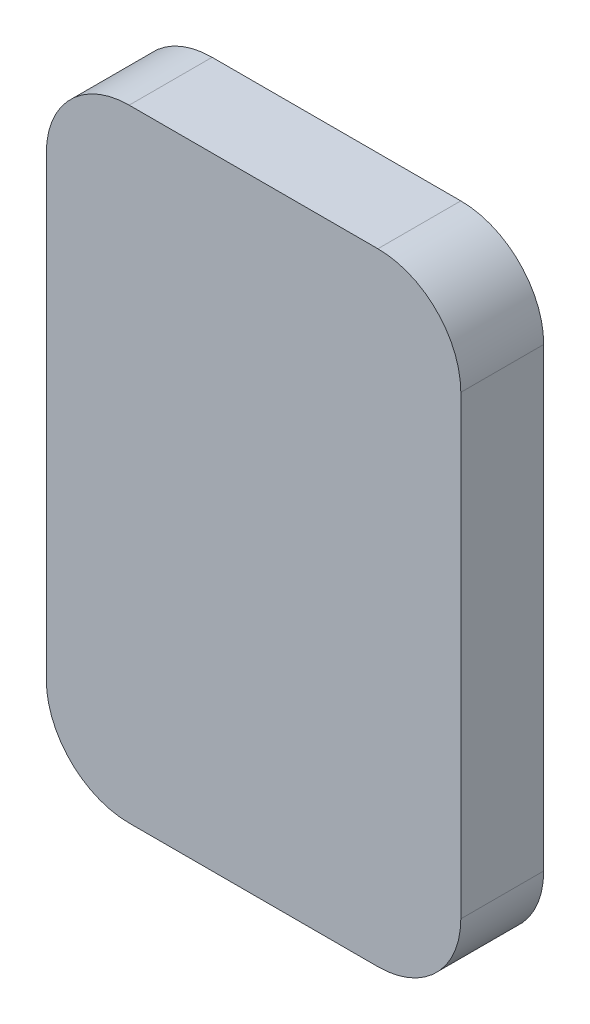
ISO-10303-21;
HEADER;
FILE_DESCRIPTION(('STEP AP214'),'2;1');
FILE_NAME('part.step','',(''),(''),'','','');
FILE_SCHEMA(('AUTOMOTIVE_DESIGN { 1 0 10303 214 1 1 1 1 }'));
ENDSEC;
DATA;
#1=APPLICATION_CONTEXT('core data for automotive mechanical design processes');
#2=APPLICATION_PROTOCOL_DEFINITION('international standard','automotive_design',2000,#1);
#3=PRODUCT_CONTEXT('',#1,'mechanical');
#4=PRODUCT('Part','Part','',(#3));
#5=PRODUCT_RELATED_PRODUCT_CATEGORY('part','',(#4));
#6=PRODUCT_DEFINITION_FORMATION('','',#4);
#7=PRODUCT_DEFINITION_CONTEXT('part definition',#1,'design');
#8=PRODUCT_DEFINITION('design','',#6,#7);
#9=PRODUCT_DEFINITION_SHAPE('','',#8);
#10=(LENGTH_UNIT() NAMED_UNIT(*) SI_UNIT(.MILLI.,.METRE.));
#11=(NAMED_UNIT(*) PLANE_ANGLE_UNIT() SI_UNIT($,.RADIAN.));
#12=(NAMED_UNIT(*) SI_UNIT($,.STERADIAN.) SOLID_ANGLE_UNIT());
#13=UNCERTAINTY_MEASURE_WITH_UNIT(LENGTH_MEASURE(1.E-05),#10,'distance_accuracy_value','');
#14=(GEOMETRIC_REPRESENTATION_CONTEXT(3) GLOBAL_UNCERTAINTY_ASSIGNED_CONTEXT((#13)) GLOBAL_UNIT_ASSIGNED_CONTEXT((#10,
#11,#12)) REPRESENTATION_CONTEXT('',''));
#15=CARTESIAN_POINT('',(0.,0.,0.));
#16=DIRECTION('',(0.,0.,1.));
#17=DIRECTION('',(1.,0.,0.));
#18=AXIS2_PLACEMENT_3D('',#15,#16,#17);
#19=CARTESIAN_POINT('',(-0.800186650059145,15.,1.25133902045073));
#20=DIRECTION('',(-1.,0.,0.));
#21=DIRECTION('',(0.,0.,1.));
#22=AXIS2_PLACEMENT_3D('',#19,#20,#21);
#23=PLANE('',#22);
#24=DIRECTION('',(0.,-1.,0.));
#25=VECTOR('',#24,1.);
#26=CARTESIAN_POINT('',(-0.800186650059145,15.,3.25133902045073));
#27=LINE('',#26,#25);
#28=CARTESIAN_POINT('',(-0.800186650059145,13.,3.25133902045073));
#29=VERTEX_POINT('',#28);
#30=CARTESIAN_POINT('',(-0.800186650059145,2.,3.25133902045073));
#31=VERTEX_POINT('',#30);
#32=EDGE_CURVE('E191',#29,#31,#27,.T.);
#33=ORIENTED_EDGE('',*,*,#32,.T.);
#34=DIRECTION('',(0.,0.,-1.));
#35=VECTOR('',#34,1.);
#36=CARTESIAN_POINT('',(-0.800186650059145,2.,1.25133902045073));
#37=LINE('',#36,#35);
#38=CARTESIAN_POINT('',(-0.800186650059145,2.,1.25133902045073));
#39=VERTEX_POINT('',#38);
#40=EDGE_CURVE('E216',#31,#39,#37,.T.);
#41=ORIENTED_EDGE('',*,*,#40,.T.);
#42=DIRECTION('',(0.,-1.,0.));
#43=VECTOR('',#42,1.);
#44=CARTESIAN_POINT('',(-0.800186650059145,15.,1.25133902045073));
#45=LINE('',#44,#43);
#46=CARTESIAN_POINT('',(-0.800186650059145,13.,1.25133902045073));
#47=VERTEX_POINT('',#46);
#48=EDGE_CURVE('E203',#47,#39,#45,.T.);
#49=ORIENTED_EDGE('',*,*,#48,.F.);
#50=DIRECTION('',(0.,0.,-1.));
#51=VECTOR('',#50,1.);
#52=CARTESIAN_POINT('',(-0.800186650059145,13.,3.25133902045073));
#53=LINE('',#52,#51);
#54=EDGE_CURVE('E214',#47,#29,#53,.F.);
#55=ORIENTED_EDGE('',*,*,#54,.T.);
#56=EDGE_LOOP('',(#33,#41,#49,#55));
#57=FACE_BOUND('',#56,.T.);
#58=ADVANCED_FACE('F33',(#57),#23,.F.);
#59=CARTESIAN_POINT('',(-10.8001866500591,15.,1.25133902045073));
#60=DIRECTION('',(0.,0.,1.));
#61=DIRECTION('',(1.,0.,0.));
#62=AXIS2_PLACEMENT_3D('',#59,#60,#61);
#63=PLANE('',#62);
#64=DIRECTION('',(1.,0.,0.));
#65=VECTOR('',#64,1.);
#66=CARTESIAN_POINT('',(-10.8001866500591,1.6,1.25133902045073));
#67=LINE('',#66,#65);
#68=CARTESIAN_POINT('',(-6.80018665005915,1.6,1.25133902045073));
#69=VERTEX_POINT('',#68);
#70=CARTESIAN_POINT('',(-4.80018665005915,1.6,1.25133902045073));
#71=VERTEX_POINT('',#70);
#72=EDGE_CURVE('E250',#69,#71,#67,.T.);
#73=ORIENTED_EDGE('',*,*,#72,.T.);
#74=DIRECTION('',(0.,-1.,0.));
#75=VECTOR('',#74,1.);
#76=CARTESIAN_POINT('',(-4.80018665005915,15.,1.25133902045073));
#77=LINE('',#76,#75);
#78=CARTESIAN_POINT('',(-4.80018665005915,7.5,1.25133902045073));
#79=VERTEX_POINT('',#78);
#80=EDGE_CURVE('E212',#79,#71,#77,.T.);
#81=ORIENTED_EDGE('',*,*,#80,.F.);
#82=DIRECTION('',(1.,0.,0.));
#83=VECTOR('',#82,1.);
#84=CARTESIAN_POINT('',(-10.8001866500591,7.5,1.25133902045073));
#85=LINE('',#84,#83);
#86=CARTESIAN_POINT('',(-6.80018665005915,7.5,1.25133902045073));
#87=VERTEX_POINT('',#86);
#88=EDGE_CURVE('E206',#87,#79,#85,.T.);
#89=ORIENTED_EDGE('',*,*,#88,.F.);
#90=DIRECTION('',(0.,1.,0.));
#91=VECTOR('',#90,1.);
#92=CARTESIAN_POINT('',(-6.80018665005915,15.,1.25133902045073));
#93=LINE('',#92,#91);
#94=EDGE_CURVE('E209',#69,#87,#93,.T.);
#95=ORIENTED_EDGE('',*,*,#94,.F.);
#96=EDGE_LOOP('',(#73,#81,#89,#95));
#97=FACE_BOUND('',#96,.T.);
#98=ORIENTED_EDGE('',*,*,#48,.T.);
#99=CARTESIAN_POINT('',(-2.80018665005915,2.,1.25133902045073));
#100=DIRECTION('',(0.,0.,1.));
#101=DIRECTION('',(1.,0.,0.));
#102=AXIS2_PLACEMENT_3D('',#99,#100,#101);
#103=CIRCLE('',#102,2.);
#104=CARTESIAN_POINT('',(-2.80018665005915,0.,1.25133902045073));
#105=VERTEX_POINT('',#104);
#106=EDGE_CURVE('E225',#39,#105,#103,.F.);
#107=ORIENTED_EDGE('',*,*,#106,.T.);
#108=DIRECTION('',(-1.,0.,0.));
#109=VECTOR('',#108,1.);
#110=CARTESIAN_POINT('',(-10.8001866500591,0.,1.25133902045073));
#111=LINE('',#110,#109);
#112=CARTESIAN_POINT('',(-8.80018665005914,0.,1.25133902045073));
#113=VERTEX_POINT('',#112);
#114=EDGE_CURVE('E177',#105,#113,#111,.T.);
#115=ORIENTED_EDGE('',*,*,#114,.T.);
#116=CARTESIAN_POINT('',(-8.80018665005914,2.,1.25133902045073));
#117=DIRECTION('',(0.,0.,1.));
#118=DIRECTION('',(1.,0.,0.));
#119=AXIS2_PLACEMENT_3D('',#116,#117,#118);
#120=CIRCLE('',#119,2.);
#121=CARTESIAN_POINT('',(-10.8001866500591,2.,1.25133902045073));
#122=VERTEX_POINT('',#121);
#123=EDGE_CURVE('E223',#113,#122,#120,.F.);
#124=ORIENTED_EDGE('',*,*,#123,.T.);
#125=DIRECTION('',(0.,-1.,0.));
#126=VECTOR('',#125,1.);
#127=CARTESIAN_POINT('',(-10.8001866500591,15.,1.25133902045073));
#128=LINE('',#127,#126);
#129=CARTESIAN_POINT('',(-10.8001866500591,13.,1.25133902045073));
#130=VERTEX_POINT('',#129);
#131=EDGE_CURVE('E200',#130,#122,#128,.T.);
#132=ORIENTED_EDGE('',*,*,#131,.F.);
#133=CARTESIAN_POINT('',(-8.80018665005914,13.,1.25133902045073));
#134=DIRECTION('',(0.,0.,1.));
#135=DIRECTION('',(1.,0.,0.));
#136=AXIS2_PLACEMENT_3D('',#133,#134,#135);
#137=CIRCLE('',#136,2.);
#138=CARTESIAN_POINT('',(-8.80018665005914,15.,1.25133902045073));
#139=VERTEX_POINT('',#138);
#140=EDGE_CURVE('E221',#130,#139,#137,.F.);
#141=ORIENTED_EDGE('',*,*,#140,.T.);
#142=DIRECTION('',(-1.,0.,0.));
#143=VECTOR('',#142,1.);
#144=CARTESIAN_POINT('',(-10.8001866500591,15.,1.25133902045073));
#145=LINE('',#144,#143);
#146=CARTESIAN_POINT('',(-2.80018665005915,15.,1.25133902045073));
#147=VERTEX_POINT('',#146);
#148=EDGE_CURVE('E186',#147,#139,#145,.T.);
#149=ORIENTED_EDGE('',*,*,#148,.F.);
#150=CARTESIAN_POINT('',(-2.80018665005915,13.,1.25133902045073));
#151=DIRECTION('',(0.,0.,1.));
#152=DIRECTION('',(1.,0.,0.));
#153=AXIS2_PLACEMENT_3D('',#150,#151,#152);
#154=CIRCLE('',#153,2.);
#155=EDGE_CURVE('E219',#147,#47,#154,.F.);
#156=ORIENTED_EDGE('',*,*,#155,.T.);
#157=EDGE_LOOP('',(#98,#107,#115,#124,#132,#141,#149,#156));
#158=FACE_BOUND('',#157,.T.);
#159=ADVANCED_FACE('F311',(#97,#158),#63,.F.);
#160=CARTESIAN_POINT('',(-10.8001866500591,15.,1.25133902045073));
#161=DIRECTION('',(1.,0.,0.));
#162=DIRECTION('',(0.,0.,-1.));
#163=AXIS2_PLACEMENT_3D('',#160,#161,#162);
#164=PLANE('',#163);
#165=ORIENTED_EDGE('',*,*,#131,.T.);
#166=DIRECTION('',(0.,0.,1.));
#167=VECTOR('',#166,1.);
#168=CARTESIAN_POINT('',(-10.8001866500591,2.,1.25133902045073));
#169=LINE('',#168,#167);
#170=CARTESIAN_POINT('',(-10.8001866500591,2.,3.25133902045073));
#171=VERTEX_POINT('',#170);
#172=EDGE_CURVE('E241',#122,#171,#169,.T.);
#173=ORIENTED_EDGE('',*,*,#172,.T.);
#174=DIRECTION('',(0.,-1.,0.));
#175=VECTOR('',#174,1.);
#176=CARTESIAN_POINT('',(-10.8001866500591,15.,3.25133902045073));
#177=LINE('',#176,#175);
#178=CARTESIAN_POINT('',(-10.8001866500591,13.,3.25133902045073));
#179=VERTEX_POINT('',#178);
#180=EDGE_CURVE('E197',#179,#171,#177,.T.);
#181=ORIENTED_EDGE('',*,*,#180,.F.);
#182=DIRECTION('',(0.,0.,1.));
#183=VECTOR('',#182,1.);
#184=CARTESIAN_POINT('',(-10.8001866500591,13.,1.25133902045073));
#185=LINE('',#184,#183);
#186=EDGE_CURVE('E239',#179,#130,#185,.F.);
#187=ORIENTED_EDGE('',*,*,#186,.T.);
#188=EDGE_LOOP('',(#165,#173,#181,#187));
#189=FACE_BOUND('',#188,.T.);
#190=ADVANCED_FACE('F319',(#189),#164,.F.);
#191=CARTESIAN_POINT('',(-10.8001866500591,15.,3.25133902045073));
#192=DIRECTION('',(0.,0.,-1.));
#193=DIRECTION('',(-1.,0.,0.));
#194=AXIS2_PLACEMENT_3D('',#191,#192,#193);
#195=PLANE('',#194);
#196=DIRECTION('',(1.,0.,0.));
#197=VECTOR('',#196,1.);
#198=CARTESIAN_POINT('',(-10.8001866500591,0.,3.25133902045073));
#199=LINE('',#198,#197);
#200=CARTESIAN_POINT('',(-8.80018665005914,0.,3.25133902045073));
#201=VERTEX_POINT('',#200);
#202=CARTESIAN_POINT('',(-2.80018665005915,0.,3.25133902045073));
#203=VERTEX_POINT('',#202);
#204=EDGE_CURVE('E180',#201,#203,#199,.T.);
#205=ORIENTED_EDGE('',*,*,#204,.T.);
#206=CARTESIAN_POINT('',(-2.80018665005915,2.,3.25133902045073));
#207=DIRECTION('',(0.,0.,-1.));
#208=DIRECTION('',(-1.,0.,0.));
#209=AXIS2_PLACEMENT_3D('',#206,#207,#208);
#210=CIRCLE('',#209,2.);
#211=EDGE_CURVE('E237',#203,#31,#210,.F.);
#212=ORIENTED_EDGE('',*,*,#211,.T.);
#213=ORIENTED_EDGE('',*,*,#32,.F.);
#214=CARTESIAN_POINT('',(-2.80018665005915,13.,3.25133902045073));
#215=DIRECTION('',(0.,0.,-1.));
#216=DIRECTION('',(-1.,0.,0.));
#217=AXIS2_PLACEMENT_3D('',#214,#215,#216);
#218=CIRCLE('',#217,2.);
#219=CARTESIAN_POINT('',(-2.80018665005915,15.,3.25133902045073));
#220=VERTEX_POINT('',#219);
#221=EDGE_CURVE('E231',#29,#220,#218,.F.);
#222=ORIENTED_EDGE('',*,*,#221,.T.);
#223=DIRECTION('',(1.,0.,0.));
#224=VECTOR('',#223,1.);
#225=CARTESIAN_POINT('',(-10.8001866500591,15.,3.25133902045073));
#226=LINE('',#225,#224);
#227=CARTESIAN_POINT('',(-8.80018665005914,15.,3.25133902045073));
#228=VERTEX_POINT('',#227);
#229=EDGE_CURVE('E189',#228,#220,#226,.T.);
#230=ORIENTED_EDGE('',*,*,#229,.F.);
#231=CARTESIAN_POINT('',(-8.80018665005914,13.,3.25133902045073));
#232=DIRECTION('',(0.,0.,-1.));
#233=DIRECTION('',(-1.,0.,0.));
#234=AXIS2_PLACEMENT_3D('',#231,#232,#233);
#235=CIRCLE('',#234,2.);
#236=EDGE_CURVE('E233',#228,#179,#235,.F.);
#237=ORIENTED_EDGE('',*,*,#236,.T.);
#238=ORIENTED_EDGE('',*,*,#180,.T.);
#239=CARTESIAN_POINT('',(-8.80018665005914,2.,3.25133902045073));
#240=DIRECTION('',(0.,0.,-1.));
#241=DIRECTION('',(-1.,0.,0.));
#242=AXIS2_PLACEMENT_3D('',#239,#240,#241);
#243=CIRCLE('',#242,2.);
#244=EDGE_CURVE('E235',#171,#201,#243,.F.);
#245=ORIENTED_EDGE('',*,*,#244,.T.);
#246=EDGE_LOOP('',(#205,#212,#213,#222,#230,#237,#238,#245));
#247=FACE_BOUND('',#246,.T.);
#248=ADVANCED_FACE('F346',(#247),#195,.F.);
#249=CARTESIAN_POINT('',(0.,15.,0.));
#250=DIRECTION('',(0.,1.,0.));
#251=DIRECTION('',(0.,0.,1.));
#252=AXIS2_PLACEMENT_3D('',#249,#250,#251);
#253=PLANE('',#252);
#254=ORIENTED_EDGE('',*,*,#148,.T.);
#255=DIRECTION('',(0.,0.,1.));
#256=VECTOR('',#255,1.);
#257=CARTESIAN_POINT('',(-8.80018665005914,15.,3.25133902045073));
#258=LINE('',#257,#256);
#259=EDGE_CURVE('E247',#139,#228,#258,.T.);
#260=ORIENTED_EDGE('',*,*,#259,.T.);
#261=ORIENTED_EDGE('',*,*,#229,.T.);
#262=DIRECTION('',(0.,0.,-1.));
#263=VECTOR('',#262,1.);
#264=CARTESIAN_POINT('',(-2.80018665005915,15.,1.25133902045073));
#265=LINE('',#264,#263);
#266=EDGE_CURVE('E244',#220,#147,#265,.T.);
#267=ORIENTED_EDGE('',*,*,#266,.T.);
#268=EDGE_LOOP('',(#254,#260,#261,#267));
#269=FACE_BOUND('',#268,.T.);
#270=ADVANCED_FACE('F348',(#269),#253,.T.);
#271=CARTESIAN_POINT('',(0.,0.,0.));
#272=DIRECTION('',(0.,1.,0.));
#273=DIRECTION('',(0.,0.,1.));
#274=AXIS2_PLACEMENT_3D('',#271,#272,#273);
#275=PLANE('',#274);
#276=ORIENTED_EDGE('',*,*,#114,.F.);
#277=DIRECTION('',(0.,0.,-1.));
#278=VECTOR('',#277,1.);
#279=CARTESIAN_POINT('',(-2.80018665005915,0.,0.));
#280=LINE('',#279,#278);
#281=EDGE_CURVE('E229',#105,#203,#280,.F.);
#282=ORIENTED_EDGE('',*,*,#281,.T.);
#283=ORIENTED_EDGE('',*,*,#204,.F.);
#284=DIRECTION('',(0.,0.,1.));
#285=VECTOR('',#284,1.);
#286=CARTESIAN_POINT('',(-8.80018665005914,0.,0.));
#287=LINE('',#286,#285);
#288=EDGE_CURVE('E227',#201,#113,#287,.F.);
#289=ORIENTED_EDGE('',*,*,#288,.T.);
#290=EDGE_LOOP('',(#276,#282,#283,#289));
#291=FACE_BOUND('',#290,.T.);
#292=ADVANCED_FACE('F363',(#291),#275,.F.);
#293=CARTESIAN_POINT('',(-4.80018665005915,2.6,1.4379396429981));
#294=DIRECTION('',(-1.,0.,0.));
#295=DIRECTION('',(0.,0.,1.));
#296=AXIS2_PLACEMENT_3D('',#293,#294,#295);
#297=PLANE('',#296);
#298=DIRECTION('',(0.,0.,1.));
#299=VECTOR('',#298,1.);
#300=CARTESIAN_POINT('',(-4.80018665005915,7.5,1.4379396429981));
#301=LINE('',#300,#299);
#302=CARTESIAN_POINT('',(-4.80018665005915,7.5,0.785111254433897));
#303=VERTEX_POINT('',#302);
#304=EDGE_CURVE('E268',#303,#79,#301,.T.);
#305=ORIENTED_EDGE('',*,*,#304,.T.);
#306=ORIENTED_EDGE('',*,*,#80,.T.);
#307=CARTESIAN_POINT('',(-4.80018665005915,1.6,0.251339020450734));
#308=DIRECTION('',(-1.,0.,0.));
#309=DIRECTION('',(0.,0.,1.));
#310=AXIS2_PLACEMENT_3D('',#307,#308,#309);
#311=CIRCLE('',#310,1.);
#312=CARTESIAN_POINT('',(-4.80018665005915,2.44562828845103,0.785111254433897));
#313=VERTEX_POINT('',#312);
#314=EDGE_CURVE('E254',#71,#313,#311,.T.);
#315=ORIENTED_EDGE('',*,*,#314,.T.);
#316=DIRECTION('',(0.,1.,0.));
#317=VECTOR('',#316,1.);
#318=CARTESIAN_POINT('',(-4.80018665005915,2.6,0.785111254433897));
#319=LINE('',#318,#317);
#320=EDGE_CURVE('E55',#313,#303,#319,.T.);
#321=ORIENTED_EDGE('',*,*,#320,.T.);
#322=EDGE_LOOP('',(#305,#306,#315,#321));
#323=FACE_BOUND('',#322,.T.);
#324=ADVANCED_FACE('F369',(#323),#297,.F.);
#325=CARTESIAN_POINT('',(-6.80018665005915,2.6,1.4379396429981));
#326=DIRECTION('',(1.,0.,0.));
#327=DIRECTION('',(0.,0.,-1.));
#328=AXIS2_PLACEMENT_3D('',#325,#326,#327);
#329=PLANE('',#328);
#330=DIRECTION('',(0.,1.,0.));
#331=VECTOR('',#330,1.);
#332=CARTESIAN_POINT('',(-6.80018665005915,2.6,0.785111254433897));
#333=LINE('',#332,#331);
#334=CARTESIAN_POINT('',(-6.80018665005915,2.44562828845103,0.785111254433897));
#335=VERTEX_POINT('',#334);
#336=CARTESIAN_POINT('',(-6.80018665005915,7.5,0.785111254433897));
#337=VERTEX_POINT('',#336);
#338=EDGE_CURVE('E47',#335,#337,#333,.T.);
#339=ORIENTED_EDGE('',*,*,#338,.F.);
#340=CARTESIAN_POINT('',(-6.80018665005915,1.6,0.251339020450734));
#341=DIRECTION('',(1.,0.,0.));
#342=DIRECTION('',(0.,0.,-1.));
#343=AXIS2_PLACEMENT_3D('',#340,#341,#342);
#344=CIRCLE('',#343,1.);
#345=EDGE_CURVE('E11',#335,#69,#344,.T.);
#346=ORIENTED_EDGE('',*,*,#345,.T.);
#347=ORIENTED_EDGE('',*,*,#94,.T.);
#348=DIRECTION('',(0.,0.,-1.));
#349=VECTOR('',#348,1.);
#350=CARTESIAN_POINT('',(-6.80018665005915,7.5,1.4379396429981));
#351=LINE('',#350,#349);
#352=EDGE_CURVE('E162',#87,#337,#351,.T.);
#353=ORIENTED_EDGE('',*,*,#352,.T.);
#354=EDGE_LOOP('',(#339,#346,#347,#353));
#355=FACE_BOUND('',#354,.T.);
#356=ADVANCED_FACE('F261',(#355),#329,.F.);
#357=CARTESIAN_POINT('',(0.,2.6,0.));
#358=DIRECTION('',(0.,-1.,0.));
#359=DIRECTION('',(0.,0.,-1.));
#360=AXIS2_PLACEMENT_3D('',#357,#358,#359);
#361=PLANE('',#360);
#362=DIRECTION('',(-0.316227766016837,0.,0.948683298050514));
#363=VECTOR('',#362,1.);
#364=CARTESIAN_POINT('',(-4.40018665005915,2.6,-0.414888745566102));
#365=LINE('',#364,#363);
#366=CARTESIAN_POINT('',(-4.40018665005915,2.6,-0.414888745566102));
#367=VERTEX_POINT('',#366);
#368=CARTESIAN_POINT('',(-4.62226257206476,2.6,0.251339020450734));
#369=VERTEX_POINT('',#368);
#370=EDGE_CURVE('E275',#367,#369,#365,.T.);
#371=ORIENTED_EDGE('',*,*,#370,.T.);
#372=DIRECTION('',(1.,0.,0.));
#373=VECTOR('',#372,1.);
#374=CARTESIAN_POINT('',(0.,2.6,0.251339020450734));
#375=LINE('',#374,#373);
#376=CARTESIAN_POINT('',(-6.97811072805353,2.6,0.251339020450734));
#377=VERTEX_POINT('',#376);
#378=EDGE_CURVE('E158',#369,#377,#375,.F.);
#379=ORIENTED_EDGE('',*,*,#378,.T.);
#380=DIRECTION('',(-0.31622776601684,0.,-0.948683298050513));
#381=VECTOR('',#380,1.);
#382=CARTESIAN_POINT('',(-7.20018665005915,2.6,-0.414888745566102));
#383=LINE('',#382,#381);
#384=CARTESIAN_POINT('',(-7.20018665005915,2.6,-0.414888745566102));
#385=VERTEX_POINT('',#384);
#386=EDGE_CURVE('E151',#377,#385,#383,.T.);
#387=ORIENTED_EDGE('',*,*,#386,.T.);
#388=DIRECTION('',(0.,0.,-1.));
#389=VECTOR('',#388,1.);
#390=CARTESIAN_POINT('',(-7.20018665005915,2.6,-0.414888745566102));
#391=LINE('',#390,#389);
#392=CARTESIAN_POINT('',(-7.20018665005915,2.6,-1.79866097954927));
#393=VERTEX_POINT('',#392);
#394=EDGE_CURVE('E155',#385,#393,#391,.T.);
#395=ORIENTED_EDGE('',*,*,#394,.T.);
#396=DIRECTION('',(1.,0.,0.));
#397=VECTOR('',#396,1.);
#398=CARTESIAN_POINT('',(-4.40018665005915,2.6,-1.79866097954927));
#399=LINE('',#398,#397);
#400=CARTESIAN_POINT('',(-4.40018665005915,2.6,-1.79866097954927));
#401=VERTEX_POINT('',#400);
#402=EDGE_CURVE('E172',#393,#401,#399,.T.);
#403=ORIENTED_EDGE('',*,*,#402,.T.);
#404=DIRECTION('',(0.,0.,1.));
#405=VECTOR('',#404,1.);
#406=CARTESIAN_POINT('',(-4.40018665005915,2.6,-0.414888745566102));
#407=LINE('',#406,#405);
#408=EDGE_CURVE('E287',#401,#367,#407,.T.);
#409=ORIENTED_EDGE('',*,*,#408,.T.);
#410=EDGE_LOOP('',(#371,#379,#387,#395,#403,#409));
#411=FACE_BOUND('',#410,.T.);
#412=ADVANCED_FACE('F154',(#411),#361,.T.);
#413=CARTESIAN_POINT('',(0.,7.5,0.));
#414=DIRECTION('',(0.,-1.,0.));
#415=DIRECTION('',(0.,0.,-1.));
#416=AXIS2_PLACEMENT_3D('',#413,#414,#415);
#417=PLANE('',#416);
#418=ORIENTED_EDGE('',*,*,#352,.F.);
#419=ORIENTED_EDGE('',*,*,#88,.T.);
#420=ORIENTED_EDGE('',*,*,#304,.F.);
#421=DIRECTION('',(-0.316227766016837,0.,0.948683298050514));
#422=VECTOR('',#421,1.);
#423=CARTESIAN_POINT('',(-4.40018665005915,7.5,-0.414888745566102));
#424=LINE('',#423,#422);
#425=CARTESIAN_POINT('',(-4.40018665005915,7.5,-0.414888745566102));
#426=VERTEX_POINT('',#425);
#427=EDGE_CURVE('E270',#426,#303,#424,.T.);
#428=ORIENTED_EDGE('',*,*,#427,.F.);
#429=DIRECTION('',(0.,0.,1.));
#430=VECTOR('',#429,1.);
#431=CARTESIAN_POINT('',(-4.40018665005915,7.5,-0.414888745566102));
#432=LINE('',#431,#430);
#433=CARTESIAN_POINT('',(-4.40018665005915,7.5,-1.79866097954927));
#434=VERTEX_POINT('',#433);
#435=EDGE_CURVE('E286',#434,#426,#432,.T.);
#436=ORIENTED_EDGE('',*,*,#435,.F.);
#437=DIRECTION('',(1.,0.,0.));
#438=VECTOR('',#437,1.);
#439=CARTESIAN_POINT('',(-4.40018665005915,7.5,-1.79866097954927));
#440=LINE('',#439,#438);
#441=CARTESIAN_POINT('',(-7.20018665005915,7.5,-1.79866097954927));
#442=VERTEX_POINT('',#441);
#443=EDGE_CURVE('E291',#442,#434,#440,.T.);
#444=ORIENTED_EDGE('',*,*,#443,.F.);
#445=DIRECTION('',(0.,0.,-1.));
#446=VECTOR('',#445,1.);
#447=CARTESIAN_POINT('',(-7.20018665005915,7.5,-0.414888745566102));
#448=LINE('',#447,#446);
#449=CARTESIAN_POINT('',(-7.20018665005915,7.5,-0.414888745566102));
#450=VERTEX_POINT('',#449);
#451=EDGE_CURVE('E293',#450,#442,#448,.T.);
#452=ORIENTED_EDGE('',*,*,#451,.F.);
#453=DIRECTION('',(-0.31622776601684,0.,-0.948683298050513));
#454=VECTOR('',#453,1.);
#455=CARTESIAN_POINT('',(-7.20018665005915,7.5,-0.414888745566102));
#456=LINE('',#455,#454);
#457=EDGE_CURVE('E176',#337,#450,#456,.T.);
#458=ORIENTED_EDGE('',*,*,#457,.F.);
#459=EDGE_LOOP('',(#418,#419,#420,#428,#436,#444,#452,#458));
#460=FACE_BOUND('',#459,.T.);
#461=ADVANCED_FACE('F265',(#460),#417,.F.);
#462=CARTESIAN_POINT('',(-7.20018665005915,2.6,-0.414888745566102));
#463=DIRECTION('',(0.948683298050513,0.,-0.31622776601684));
#464=DIRECTION('',(-0.31622776601684,0.,-0.948683298050513));
#465=AXIS2_PLACEMENT_3D('',#462,#463,#464);
#466=PLANE('',#465);
#467=ORIENTED_EDGE('',*,*,#457,.T.);
#468=DIRECTION('',(0.,1.,0.));
#469=VECTOR('',#468,1.);
#470=CARTESIAN_POINT('',(-7.20018665005915,2.6,-0.414888745566102));
#471=LINE('',#470,#469);
#472=EDGE_CURVE('E167',#385,#450,#471,.T.);
#473=ORIENTED_EDGE('',*,*,#472,.F.);
#474=ORIENTED_EDGE('',*,*,#386,.F.);
#475=CARTESIAN_POINT('',(-6.97811072805353,1.6,0.251339020450734));
#476=DIRECTION('',(0.948683298050513,0.,-0.31622776601684));
#477=DIRECTION('',(0.31622776601684,0.,0.948683298050513));
#478=AXIS2_PLACEMENT_3D('',#475,#476,#477);
#479=ELLIPSE('',#478,1.05409255338946,1.);
#480=EDGE_CURVE('E41',#377,#335,#479,.T.);
#481=ORIENTED_EDGE('',*,*,#480,.T.);
#482=ORIENTED_EDGE('',*,*,#338,.T.);
#483=EDGE_LOOP('',(#467,#473,#474,#481,#482));
#484=FACE_BOUND('',#483,.T.);
#485=ADVANCED_FACE('F174',(#484),#466,.F.);
#486=CARTESIAN_POINT('',(-7.20018665005915,2.6,-0.414888745566102));
#487=DIRECTION('',(1.,0.,0.));
#488=DIRECTION('',(0.,0.,-1.));
#489=AXIS2_PLACEMENT_3D('',#486,#487,#488);
#490=PLANE('',#489);
#491=ORIENTED_EDGE('',*,*,#451,.T.);
#492=DIRECTION('',(0.,1.,0.));
#493=VECTOR('',#492,1.);
#494=CARTESIAN_POINT('',(-7.20018665005915,2.6,-1.79866097954927));
#495=LINE('',#494,#493);
#496=EDGE_CURVE('E170',#393,#442,#495,.T.);
#497=ORIENTED_EDGE('',*,*,#496,.F.);
#498=ORIENTED_EDGE('',*,*,#394,.F.);
#499=ORIENTED_EDGE('',*,*,#472,.T.);
#500=EDGE_LOOP('',(#491,#497,#498,#499));
#501=FACE_BOUND('',#500,.T.);
#502=ADVANCED_FACE('F166',(#501),#490,.F.);
#503=CARTESIAN_POINT('',(-4.40018665005915,2.6,-1.79866097954927));
#504=DIRECTION('',(0.,0.,1.));
#505=DIRECTION('',(1.,0.,0.));
#506=AXIS2_PLACEMENT_3D('',#503,#504,#505);
#507=PLANE('',#506);
#508=ORIENTED_EDGE('',*,*,#443,.T.);
#509=DIRECTION('',(0.,1.,0.));
#510=VECTOR('',#509,1.);
#511=CARTESIAN_POINT('',(-4.40018665005915,2.6,-1.79866097954927));
#512=LINE('',#511,#510);
#513=EDGE_CURVE('E182',#401,#434,#512,.T.);
#514=ORIENTED_EDGE('',*,*,#513,.F.);
#515=ORIENTED_EDGE('',*,*,#402,.F.);
#516=ORIENTED_EDGE('',*,*,#496,.T.);
#517=EDGE_LOOP('',(#508,#514,#515,#516));
#518=FACE_BOUND('',#517,.T.);
#519=ADVANCED_FACE('F300',(#518),#507,.F.);
#520=CARTESIAN_POINT('',(-4.40018665005915,2.6,-0.414888745566102));
#521=DIRECTION('',(-1.,0.,0.));
#522=DIRECTION('',(0.,0.,1.));
#523=AXIS2_PLACEMENT_3D('',#520,#521,#522);
#524=PLANE('',#523);
#525=ORIENTED_EDGE('',*,*,#435,.T.);
#526=DIRECTION('',(0.,1.,0.));
#527=VECTOR('',#526,1.);
#528=CARTESIAN_POINT('',(-4.40018665005915,2.6,-0.414888745566102));
#529=LINE('',#528,#527);
#530=EDGE_CURVE('E277',#367,#426,#529,.T.);
#531=ORIENTED_EDGE('',*,*,#530,.F.);
#532=ORIENTED_EDGE('',*,*,#408,.F.);
#533=ORIENTED_EDGE('',*,*,#513,.T.);
#534=EDGE_LOOP('',(#525,#531,#532,#533));
#535=FACE_BOUND('',#534,.T.);
#536=ADVANCED_FACE('F284',(#535),#524,.F.);
#537=CARTESIAN_POINT('',(-4.40018665005915,2.6,-0.414888745566102));
#538=DIRECTION('',(-0.948683298050514,0.,-0.316227766016837));
#539=DIRECTION('',(-0.316227766016837,0.,0.948683298050514));
#540=AXIS2_PLACEMENT_3D('',#537,#538,#539);
#541=PLANE('',#540);
#542=ORIENTED_EDGE('',*,*,#427,.T.);
#543=ORIENTED_EDGE('',*,*,#320,.F.);
#544=CARTESIAN_POINT('',(-4.62226257206476,1.6,0.251339020450734));
#545=DIRECTION('',(-0.948683298050514,0.,-0.316227766016837));
#546=DIRECTION('',(0.316227766016837,0.,-0.948683298050514));
#547=AXIS2_PLACEMENT_3D('',#544,#545,#546);
#548=ELLIPSE('',#547,1.05409255338946,1.);
#549=EDGE_CURVE('E256',#313,#369,#548,.T.);
#550=ORIENTED_EDGE('',*,*,#549,.T.);
#551=ORIENTED_EDGE('',*,*,#370,.F.);
#552=ORIENTED_EDGE('',*,*,#530,.T.);
#553=EDGE_LOOP('',(#542,#543,#550,#551,#552));
#554=FACE_BOUND('',#553,.T.);
#555=ADVANCED_FACE('F307',(#554),#541,.F.);
#556=CARTESIAN_POINT('',(-2.80018665005915,2.,1.25133902045073));
#557=DIRECTION('',(0.,0.,-1.));
#558=DIRECTION('',(-1.,0.,0.));
#559=AXIS2_PLACEMENT_3D('',#556,#557,#558);
#560=CYLINDRICAL_SURFACE('',#559,2.);
#561=ORIENTED_EDGE('',*,*,#211,.F.);
#562=ORIENTED_EDGE('',*,*,#281,.F.);
#563=ORIENTED_EDGE('',*,*,#106,.F.);
#564=ORIENTED_EDGE('',*,*,#40,.F.);
#565=EDGE_LOOP('',(#561,#562,#563,#564));
#566=FACE_BOUND('',#565,.T.);
#567=ADVANCED_FACE('F323',(#566),#560,.T.);
#568=CARTESIAN_POINT('',(-8.80018665005914,2.,1.25133902045073));
#569=DIRECTION('',(0.,0.,1.));
#570=DIRECTION('',(1.,0.,0.));
#571=AXIS2_PLACEMENT_3D('',#568,#569,#570);
#572=CYLINDRICAL_SURFACE('',#571,2.);
#573=ORIENTED_EDGE('',*,*,#123,.F.);
#574=ORIENTED_EDGE('',*,*,#288,.F.);
#575=ORIENTED_EDGE('',*,*,#244,.F.);
#576=ORIENTED_EDGE('',*,*,#172,.F.);
#577=EDGE_LOOP('',(#573,#574,#575,#576));
#578=FACE_BOUND('',#577,.T.);
#579=ADVANCED_FACE('F326',(#578),#572,.T.);
#580=CARTESIAN_POINT('',(-8.80018665005914,13.,0.));
#581=DIRECTION('',(0.,0.,-1.));
#582=DIRECTION('',(-1.,0.,0.));
#583=AXIS2_PLACEMENT_3D('',#580,#581,#582);
#584=CYLINDRICAL_SURFACE('',#583,2.);
#585=ORIENTED_EDGE('',*,*,#140,.F.);
#586=ORIENTED_EDGE('',*,*,#186,.F.);
#587=ORIENTED_EDGE('',*,*,#236,.F.);
#588=ORIENTED_EDGE('',*,*,#259,.F.);
#589=EDGE_LOOP('',(#585,#586,#587,#588));
#590=FACE_BOUND('',#589,.T.);
#591=ADVANCED_FACE('F330',(#590),#584,.T.);
#592=CARTESIAN_POINT('',(-2.80018665005915,13.,0.));
#593=DIRECTION('',(0.,0.,1.));
#594=DIRECTION('',(1.,0.,0.));
#595=AXIS2_PLACEMENT_3D('',#592,#593,#594);
#596=CYLINDRICAL_SURFACE('',#595,2.);
#597=ORIENTED_EDGE('',*,*,#221,.F.);
#598=ORIENTED_EDGE('',*,*,#54,.F.);
#599=ORIENTED_EDGE('',*,*,#155,.F.);
#600=ORIENTED_EDGE('',*,*,#266,.F.);
#601=EDGE_LOOP('',(#597,#598,#599,#600));
#602=FACE_BOUND('',#601,.T.);
#603=ADVANCED_FACE('F333',(#602),#596,.T.);
#604=CARTESIAN_POINT('',(-10.8001866500591,1.6,0.251339020450734));
#605=DIRECTION('',(1.,0.,0.));
#606=DIRECTION('',(0.,0.,-1.));
#607=AXIS2_PLACEMENT_3D('',#604,#605,#606);
#608=CYLINDRICAL_SURFACE('',#607,1.);
#609=ORIENTED_EDGE('',*,*,#480,.F.);
#610=ORIENTED_EDGE('',*,*,#378,.F.);
#611=ORIENTED_EDGE('',*,*,#549,.F.);
#612=ORIENTED_EDGE('',*,*,#314,.F.);
#613=ORIENTED_EDGE('',*,*,#72,.F.);
#614=ORIENTED_EDGE('',*,*,#345,.F.);
#615=EDGE_LOOP('',(#609,#610,#611,#612,#613,#614));
#616=FACE_BOUND('',#615,.T.);
#617=ADVANCED_FACE('F35',(#616),#608,.F.);
#618=CLOSED_SHELL('',(#58,#159,#190,#248,#270,#292,#324,#356,#412,#461,#485,#502,#519,#536,#555,
#567,#579,#591,#603,#617));
#619=MANIFOLD_SOLID_BREP('B2',#618);
#620=ADVANCED_BREP_SHAPE_REPRESENTATION('',(#18,#619),#14);
#621=SHAPE_DEFINITION_REPRESENTATION(#9,#620);
ENDSEC;
END-ISO-10303-21;
